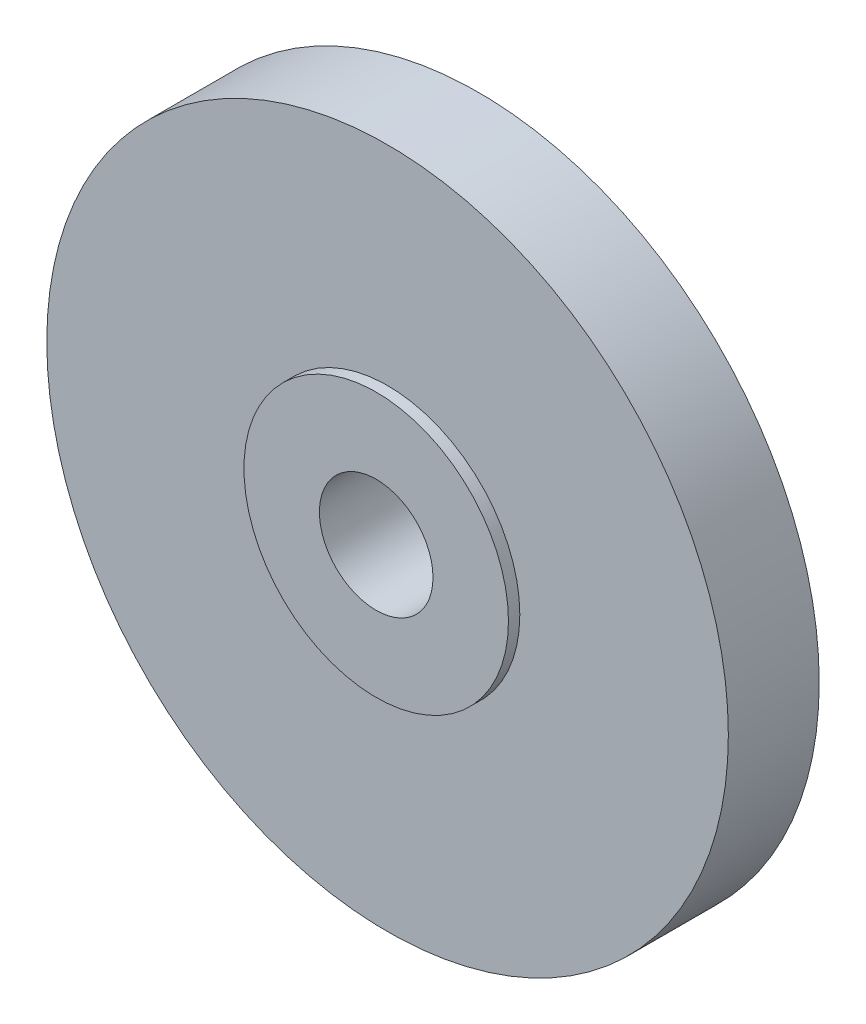
ISO-10303-21;
HEADER;
FILE_DESCRIPTION(('STEP AP214'),'2;1');
FILE_NAME('part.step','',(''),(''),'','','');
FILE_SCHEMA(('AUTOMOTIVE_DESIGN { 1 0 10303 214 1 1 1 1 }'));
ENDSEC;
DATA;
#1=APPLICATION_CONTEXT('core data for automotive mechanical design processes');
#2=APPLICATION_PROTOCOL_DEFINITION('international standard','automotive_design',2000,#1);
#3=PRODUCT_CONTEXT('',#1,'mechanical');
#4=PRODUCT('Part','Part','',(#3));
#5=PRODUCT_RELATED_PRODUCT_CATEGORY('part','',(#4));
#6=PRODUCT_DEFINITION_FORMATION('','',#4);
#7=PRODUCT_DEFINITION_CONTEXT('part definition',#1,'design');
#8=PRODUCT_DEFINITION('design','',#6,#7);
#9=PRODUCT_DEFINITION_SHAPE('','',#8);
#10=(LENGTH_UNIT() NAMED_UNIT(*) SI_UNIT(.MILLI.,.METRE.));
#11=(NAMED_UNIT(*) PLANE_ANGLE_UNIT() SI_UNIT($,.RADIAN.));
#12=(NAMED_UNIT(*) SI_UNIT($,.STERADIAN.) SOLID_ANGLE_UNIT());
#13=UNCERTAINTY_MEASURE_WITH_UNIT(LENGTH_MEASURE(1.E-05),#10,'distance_accuracy_value','');
#14=(GEOMETRIC_REPRESENTATION_CONTEXT(3) GLOBAL_UNCERTAINTY_ASSIGNED_CONTEXT((#13)) GLOBAL_UNIT_ASSIGNED_CONTEXT((#10,
#11,#12)) REPRESENTATION_CONTEXT('',''));
#15=CARTESIAN_POINT('',(0.,0.,0.));
#16=DIRECTION('',(0.,0.,1.));
#17=DIRECTION('',(1.,0.,0.));
#18=AXIS2_PLACEMENT_3D('',#15,#16,#17);
#19=CARTESIAN_POINT('',(-32.2118356618623,9.09226646248085,80.));
#20=DIRECTION('',(0.,0.,1.));
#21=DIRECTION('',(1.,0.,0.));
#22=AXIS2_PLACEMENT_3D('',#19,#20,#21);
#23=PLANE('',#22);
#24=CARTESIAN_POINT('',(-32.2118356618623,9.09226646248085,80.));
#25=DIRECTION('',(0.,0.,1.));
#26=DIRECTION('',(1.,0.,0.));
#27=AXIS2_PLACEMENT_3D('',#24,#25,#26);
#28=CIRCLE('',#27,300.);
#29=CARTESIAN_POINT('',(267.788164338138,9.09226646248085,80.));
#30=VERTEX_POINT('',#29);
#31=EDGE_CURVE('E10',#30,#30,#28,.T.);
#32=ORIENTED_EDGE('',*,*,#31,.T.);
#33=EDGE_LOOP('',(#32));
#34=FACE_BOUND('',#33,.T.);
#35=CARTESIAN_POINT('',(-32.2118356618623,9.09226646248085,80.));
#36=DIRECTION('',(0.,0.,1.));
#37=DIRECTION('',(1.,0.,0.));
#38=AXIS2_PLACEMENT_3D('',#35,#36,#37);
#39=CIRCLE('',#38,116.43);
#40=CARTESIAN_POINT('',(84.2181643381377,9.09226646248085,80.));
#41=VERTEX_POINT('',#40);
#42=EDGE_CURVE('E44',#41,#41,#39,.T.);
#43=ORIENTED_EDGE('',*,*,#42,.F.);
#44=EDGE_LOOP('',(#43));
#45=FACE_BOUND('',#44,.T.);
#46=ADVANCED_FACE('F31',(#34,#45),#23,.T.);
#47=CARTESIAN_POINT('',(-32.2118356618623,9.09226646248085,80.));
#48=DIRECTION('',(0.,0.,-1.));
#49=DIRECTION('',(-1.,0.,0.));
#50=AXIS2_PLACEMENT_3D('',#47,#48,#49);
#51=CYLINDRICAL_SURFACE('',#50,300.);
#52=ORIENTED_EDGE('',*,*,#31,.F.);
#53=EDGE_LOOP('',(#52));
#54=FACE_BOUND('',#53,.T.);
#55=CARTESIAN_POINT('',(-32.2118356618623,9.09226646248085,0.));
#56=DIRECTION('',(0.,0.,1.));
#57=DIRECTION('',(1.,0.,0.));
#58=AXIS2_PLACEMENT_3D('',#55,#56,#57);
#59=CIRCLE('',#58,300.);
#60=CARTESIAN_POINT('',(267.788164338138,9.09226646248085,0.));
#61=VERTEX_POINT('',#60);
#62=EDGE_CURVE('E35',#61,#61,#59,.T.);
#63=ORIENTED_EDGE('',*,*,#62,.T.);
#64=EDGE_LOOP('',(#63));
#65=FACE_BOUND('',#64,.T.);
#66=ADVANCED_FACE('F33',(#54,#65),#51,.T.);
#67=CARTESIAN_POINT('',(-32.2118356618623,9.09226646248085,0.));
#68=DIRECTION('',(0.,0.,1.));
#69=DIRECTION('',(1.,0.,0.));
#70=AXIS2_PLACEMENT_3D('',#67,#68,#69);
#71=PLANE('',#70);
#72=CARTESIAN_POINT('',(-32.2118356618623,9.09226646248085,0.));
#73=DIRECTION('',(0.,0.,1.));
#74=DIRECTION('',(1.,0.,0.));
#75=AXIS2_PLACEMENT_3D('',#72,#73,#74);
#76=CIRCLE('',#75,50.);
#77=CARTESIAN_POINT('',(17.7881643381377,9.09226646248085,0.));
#78=VERTEX_POINT('',#77);
#79=EDGE_CURVE('E47',#78,#78,#76,.T.);
#80=ORIENTED_EDGE('',*,*,#79,.T.);
#81=EDGE_LOOP('',(#80));
#82=FACE_BOUND('',#81,.T.);
#83=ORIENTED_EDGE('',*,*,#62,.F.);
#84=EDGE_LOOP('',(#83));
#85=FACE_BOUND('',#84,.T.);
#86=ADVANCED_FACE('F56',(#82,#85),#71,.F.);
#87=CARTESIAN_POINT('',(-32.2118356618623,9.09226646248085,90.));
#88=DIRECTION('',(0.,0.,-1.));
#89=DIRECTION('',(-1.,0.,0.));
#90=AXIS2_PLACEMENT_3D('',#87,#88,#89);
#91=CYLINDRICAL_SURFACE('',#90,116.43);
#92=CARTESIAN_POINT('',(-32.2118356618623,9.09226646248085,90.));
#93=DIRECTION('',(0.,0.,1.));
#94=DIRECTION('',(1.,0.,0.));
#95=AXIS2_PLACEMENT_3D('',#92,#93,#94);
#96=CIRCLE('',#95,116.43);
#97=CARTESIAN_POINT('',(84.2181643381377,9.09226646248085,90.));
#98=VERTEX_POINT('',#97);
#99=EDGE_CURVE('E42',#98,#98,#96,.T.);
#100=ORIENTED_EDGE('',*,*,#99,.F.);
#101=EDGE_LOOP('',(#100));
#102=FACE_BOUND('',#101,.T.);
#103=ORIENTED_EDGE('',*,*,#42,.T.);
#104=EDGE_LOOP('',(#103));
#105=FACE_BOUND('',#104,.T.);
#106=ADVANCED_FACE('F68',(#102,#105),#91,.T.);
#107=CARTESIAN_POINT('',(-32.2118356618623,9.09226646248085,90.));
#108=DIRECTION('',(0.,0.,1.));
#109=DIRECTION('',(1.,0.,0.));
#110=AXIS2_PLACEMENT_3D('',#107,#108,#109);
#111=PLANE('',#110);
#112=CARTESIAN_POINT('',(-32.2118356618623,9.09226646248085,90.));
#113=DIRECTION('',(0.,0.,1.));
#114=DIRECTION('',(1.,0.,0.));
#115=AXIS2_PLACEMENT_3D('',#112,#113,#114);
#116=CIRCLE('',#115,50.);
#117=CARTESIAN_POINT('',(17.7881643381377,9.09226646248085,90.));
#118=VERTEX_POINT('',#117);
#119=EDGE_CURVE('E50',#118,#118,#116,.T.);
#120=ORIENTED_EDGE('',*,*,#119,.F.);
#121=EDGE_LOOP('',(#120));
#122=FACE_BOUND('',#121,.T.);
#123=ORIENTED_EDGE('',*,*,#99,.T.);
#124=EDGE_LOOP('',(#123));
#125=FACE_BOUND('',#124,.T.);
#126=ADVANCED_FACE('F62',(#122,#125),#111,.T.);
#127=CARTESIAN_POINT('',(-32.2118356618623,9.09226646248085,0.));
#128=DIRECTION('',(0.,0.,1.));
#129=DIRECTION('',(1.,0.,0.));
#130=AXIS2_PLACEMENT_3D('',#127,#128,#129);
#131=CYLINDRICAL_SURFACE('',#130,50.);
#132=CARTESIAN_POINT('',(17.7881643381377,9.09226646248085,0.));
#133=CARTESIAN_POINT('',(17.7881643381377,9.09226646248085,0.937499999999998));
#134=CARTESIAN_POINT('',(17.7881643381377,9.09226646248085,1.875));
#135=CARTESIAN_POINT('',(17.7881643381377,9.09226646248085,3.75));
#136=CARTESIAN_POINT('',(17.7881643381377,9.09226646248085,4.6875));
#137=CARTESIAN_POINT('',(17.7881643381377,9.09226646248085,6.5625));
#138=CARTESIAN_POINT('',(17.7881643381377,9.09226646248085,7.5));
#139=CARTESIAN_POINT('',(17.7881643381377,9.09226646248085,9.375));
#140=CARTESIAN_POINT('',(17.7881643381377,9.09226646248085,10.3125));
#141=CARTESIAN_POINT('',(17.7881643381377,9.09226646248085,12.1875));
#142=CARTESIAN_POINT('',(17.7881643381377,9.09226646248085,13.125));
#143=CARTESIAN_POINT('',(17.7881643381377,9.09226646248085,15.));
#144=CARTESIAN_POINT('',(17.7881643381377,9.09226646248085,15.9375));
#145=CARTESIAN_POINT('',(17.7881643381377,9.09226646248085,17.8125));
#146=CARTESIAN_POINT('',(17.7881643381377,9.09226646248085,18.75));
#147=CARTESIAN_POINT('',(17.7881643381377,9.09226646248085,20.625));
#148=CARTESIAN_POINT('',(17.7881643381377,9.09226646248085,21.5625));
#149=CARTESIAN_POINT('',(17.7881643381377,9.09226646248085,23.4375));
#150=CARTESIAN_POINT('',(17.7881643381377,9.09226646248085,24.375));
#151=CARTESIAN_POINT('',(17.7881643381377,9.09226646248085,26.25));
#152=CARTESIAN_POINT('',(17.7881643381377,9.09226646248085,27.1875));
#153=CARTESIAN_POINT('',(17.7881643381377,9.09226646248085,29.0625));
#154=CARTESIAN_POINT('',(17.7881643381377,9.09226646248085,30.));
#155=CARTESIAN_POINT('',(17.7881643381377,9.09226646248085,31.875));
#156=CARTESIAN_POINT('',(17.7881643381377,9.09226646248085,32.8125));
#157=CARTESIAN_POINT('',(17.7881643381377,9.09226646248085,34.6875));
#158=CARTESIAN_POINT('',(17.7881643381377,9.09226646248085,35.625));
#159=CARTESIAN_POINT('',(17.7881643381377,9.09226646248085,37.5));
#160=CARTESIAN_POINT('',(17.7881643381377,9.09226646248085,38.4375));
#161=CARTESIAN_POINT('',(17.7881643381377,9.09226646248085,40.3125));
#162=CARTESIAN_POINT('',(17.7881643381377,9.09226646248085,41.25));
#163=CARTESIAN_POINT('',(17.7881643381377,9.09226646248085,43.125));
#164=CARTESIAN_POINT('',(17.7881643381377,9.09226646248085,44.0625));
#165=CARTESIAN_POINT('',(17.7881643381377,9.09226646248085,45.9375));
#166=CARTESIAN_POINT('',(17.7881643381377,9.09226646248085,46.875));
#167=CARTESIAN_POINT('',(17.7881643381377,9.09226646248085,48.75));
#168=CARTESIAN_POINT('',(17.7881643381377,9.09226646248085,49.6875));
#169=CARTESIAN_POINT('',(17.7881643381377,9.09226646248085,51.5625));
#170=CARTESIAN_POINT('',(17.7881643381377,9.09226646248085,52.5));
#171=CARTESIAN_POINT('',(17.7881643381377,9.09226646248085,54.375));
#172=CARTESIAN_POINT('',(17.7881643381377,9.09226646248085,55.3125));
#173=CARTESIAN_POINT('',(17.7881643381377,9.09226646248085,57.1875));
#174=CARTESIAN_POINT('',(17.7881643381377,9.09226646248085,58.125));
#175=CARTESIAN_POINT('',(17.7881643381377,9.09226646248085,60.));
#176=CARTESIAN_POINT('',(17.7881643381377,9.09226646248085,60.9375));
#177=CARTESIAN_POINT('',(17.7881643381377,9.09226646248085,62.8125));
#178=CARTESIAN_POINT('',(17.7881643381377,9.09226646248085,63.75));
#179=CARTESIAN_POINT('',(17.7881643381377,9.09226646248085,65.625));
#180=CARTESIAN_POINT('',(17.7881643381377,9.09226646248085,66.5625));
#181=CARTESIAN_POINT('',(17.7881643381377,9.09226646248085,68.4375));
#182=CARTESIAN_POINT('',(17.7881643381377,9.09226646248085,69.375));
#183=CARTESIAN_POINT('',(17.7881643381377,9.09226646248085,71.25));
#184=CARTESIAN_POINT('',(17.7881643381377,9.09226646248085,72.1875));
#185=CARTESIAN_POINT('',(17.7881643381377,9.09226646248085,74.0625));
#186=CARTESIAN_POINT('',(17.7881643381377,9.09226646248085,75.));
#187=CARTESIAN_POINT('',(17.7881643381377,9.09226646248085,76.875));
#188=CARTESIAN_POINT('',(17.7881643381377,9.09226646248085,77.8125));
#189=CARTESIAN_POINT('',(17.7881643381377,9.09226646248085,79.6875));
#190=CARTESIAN_POINT('',(17.7881643381377,9.09226646248085,80.625));
#191=CARTESIAN_POINT('',(17.7881643381377,9.09226646248085,82.5));
#192=CARTESIAN_POINT('',(17.7881643381377,9.09226646248085,83.4375));
#193=CARTESIAN_POINT('',(17.7881643381377,9.09226646248085,85.3125));
#194=CARTESIAN_POINT('',(17.7881643381377,9.09226646248085,86.25));
#195=CARTESIAN_POINT('',(17.7881643381377,9.09226646248085,88.125));
#196=CARTESIAN_POINT('',(17.7881643381377,9.09226646248085,89.0625));
#197=CARTESIAN_POINT('',(17.7881643381377,9.09226646248085,90.));
#198=B_SPLINE_CURVE_WITH_KNOTS('',3,(#132,#133,#134,#135,#136,#137,#138,#139,#140,#141,#142,
#143,#144,#145,#146,#147,#148,#149,#150,#151,#152,#153,#154,#155,#156,#157,#158,#159,#160,#161,
#162,#163,#164,#165,#166,#167,#168,#169,#170,#171,#172,#173,#174,#175,#176,#177,#178,#179,#180,
#181,#182,#183,#184,#185,#186,#187,#188,#189,#190,#191,#192,#193,#194,#195,#196,#197),
.UNSPECIFIED.,.F.,.F.,(4,2,2,2,2,2,2,2,2,2,2,2,2,2,2,2,2,2,2,2,2,2,2,2,2,2,2,2,2,2,2,2,4),(0.,
2.8125,5.625,8.4375,11.25,14.0625,16.875,19.6875,22.5,25.3125,28.125,30.9375,33.75,36.5625,
39.375,42.1875,45.,47.8125,50.625,53.4375,56.25,59.0625,61.875,64.6875,67.5,70.3125,73.125,
75.9375,78.75,81.5625,84.375,87.1875,90.),.UNSPECIFIED.);
#199=EDGE_CURVE('BSEAM59',#78,#118,#198,.T.);
#200=ORIENTED_EDGE('',*,*,#79,.F.);
#201=ORIENTED_EDGE('',*,*,#119,.T.);
#202=ORIENTED_EDGE('',*,*,#199,.T.);
#203=ORIENTED_EDGE('',*,*,#199,.F.);
#204=EDGE_LOOP('',(#200,#202,#201,#203));
#205=FACE_BOUND('',#204,.T.);
#206=ADVANCED_FACE('F59',(#205),#131,.F.);
#207=CLOSED_SHELL('',(#46,#66,#86,#106,#126,#206));
#208=MANIFOLD_SOLID_BREP('B2',#207);
#209=ADVANCED_BREP_SHAPE_REPRESENTATION('',(#18,#208),#14);
#210=SHAPE_DEFINITION_REPRESENTATION(#9,#209);
ENDSEC;
END-ISO-10303-21;
